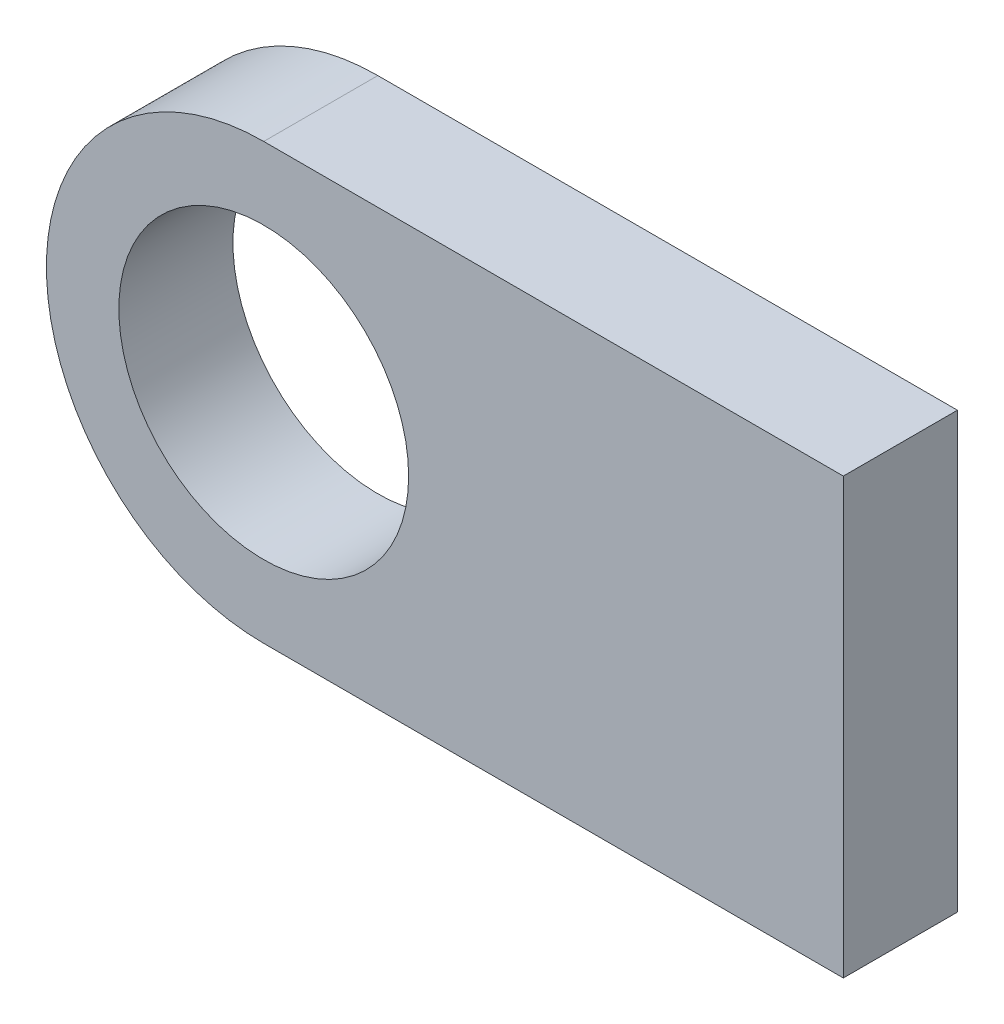
ISO-10303-21;
HEADER;
FILE_DESCRIPTION(('STEP AP214'),'2;1');
FILE_NAME('part.step','',(''),(''),'','','');
FILE_SCHEMA(('AUTOMOTIVE_DESIGN { 1 0 10303 214 1 1 1 1 }'));
ENDSEC;
DATA;
#1=APPLICATION_CONTEXT('core data for automotive mechanical design processes');
#2=APPLICATION_PROTOCOL_DEFINITION('international standard','automotive_design',2000,#1);
#3=PRODUCT_CONTEXT('',#1,'mechanical');
#4=PRODUCT('Part','Part','',(#3));
#5=PRODUCT_RELATED_PRODUCT_CATEGORY('part','',(#4));
#6=PRODUCT_DEFINITION_FORMATION('','',#4);
#7=PRODUCT_DEFINITION_CONTEXT('part definition',#1,'design');
#8=PRODUCT_DEFINITION('design','',#6,#7);
#9=PRODUCT_DEFINITION_SHAPE('','',#8);
#10=(LENGTH_UNIT() NAMED_UNIT(*) SI_UNIT(.MILLI.,.METRE.));
#11=(NAMED_UNIT(*) PLANE_ANGLE_UNIT() SI_UNIT($,.RADIAN.));
#12=(NAMED_UNIT(*) SI_UNIT($,.STERADIAN.) SOLID_ANGLE_UNIT());
#13=UNCERTAINTY_MEASURE_WITH_UNIT(LENGTH_MEASURE(1.E-05),#10,'distance_accuracy_value','');
#14=(GEOMETRIC_REPRESENTATION_CONTEXT(3) GLOBAL_UNCERTAINTY_ASSIGNED_CONTEXT((#13)) GLOBAL_UNIT_ASSIGNED_CONTEXT((#10,
#11,#12)) REPRESENTATION_CONTEXT('',''));
#15=CARTESIAN_POINT('',(0.,0.,0.));
#16=DIRECTION('',(0.,0.,1.));
#17=DIRECTION('',(1.,0.,0.));
#18=AXIS2_PLACEMENT_3D('',#15,#16,#17);
#19=CARTESIAN_POINT('',(0.,19.05,-10.000000066));
#20=DIRECTION('',(0.,0.,1.));
#21=DIRECTION('',(1.,0.,0.));
#22=AXIS2_PLACEMENT_3D('',#19,#20,#21);
#23=CYLINDRICAL_SURFACE('',#22,19.05);
#24=CARTESIAN_POINT('',(0.,19.05,0.));
#25=DIRECTION('',(0.,0.,1.));
#26=DIRECTION('',(1.,0.,0.));
#27=AXIS2_PLACEMENT_3D('',#24,#25,#26);
#28=CIRCLE('',#27,19.05);
#29=CARTESIAN_POINT('',(0.,38.1,0.));
#30=VERTEX_POINT('',#29);
#31=CARTESIAN_POINT('',(0.,0.,0.));
#32=VERTEX_POINT('',#31);
#33=EDGE_CURVE('E105',#30,#32,#28,.T.);
#34=ORIENTED_EDGE('',*,*,#33,.F.);
#35=DIRECTION('',(0.,0.,1.));
#36=VECTOR('',#35,1.);
#37=CARTESIAN_POINT('',(0.,38.1,-10.000000066));
#38=LINE('',#37,#36);
#39=CARTESIAN_POINT('',(0.,38.1,-10.000000066));
#40=VERTEX_POINT('',#39);
#41=EDGE_CURVE('E11',#40,#30,#38,.T.);
#42=ORIENTED_EDGE('',*,*,#41,.F.);
#43=CARTESIAN_POINT('',(0.,19.05,-10.000000066));
#44=DIRECTION('',(0.,0.,1.));
#45=DIRECTION('',(1.,0.,0.));
#46=AXIS2_PLACEMENT_3D('',#43,#44,#45);
#47=CIRCLE('',#46,19.05);
#48=CARTESIAN_POINT('',(0.,0.,-10.000000066));
#49=VERTEX_POINT('',#48);
#50=EDGE_CURVE('E98',#40,#49,#47,.T.);
#51=ORIENTED_EDGE('',*,*,#50,.T.);
#52=DIRECTION('',(0.,0.,1.));
#53=VECTOR('',#52,1.);
#54=CARTESIAN_POINT('',(0.,0.,-10.000000066));
#55=LINE('',#54,#53);
#56=EDGE_CURVE('E42',#49,#32,#55,.T.);
#57=ORIENTED_EDGE('',*,*,#56,.T.);
#58=EDGE_LOOP('',(#34,#42,#51,#57));
#59=FACE_BOUND('',#58,.T.);
#60=ADVANCED_FACE('F39',(#59),#23,.T.);
#61=CARTESIAN_POINT('',(0.,38.1,-10.000000066));
#62=DIRECTION('',(0.,1.,0.));
#63=DIRECTION('',(0.,0.,1.));
#64=AXIS2_PLACEMENT_3D('',#61,#62,#63);
#65=PLANE('',#64);
#66=DIRECTION('',(-1.,0.,0.));
#67=VECTOR('',#66,1.);
#68=CARTESIAN_POINT('',(0.,38.1,0.));
#69=LINE('',#68,#67);
#70=CARTESIAN_POINT('',(50.8,38.1,0.));
#71=VERTEX_POINT('',#70);
#72=EDGE_CURVE('E100',#71,#30,#69,.T.);
#73=ORIENTED_EDGE('',*,*,#72,.F.);
#74=DIRECTION('',(0.,0.,1.));
#75=VECTOR('',#74,1.);
#76=CARTESIAN_POINT('',(50.8,38.1,-10.000000066));
#77=LINE('',#76,#75);
#78=CARTESIAN_POINT('',(50.8,38.1,-10.000000066));
#79=VERTEX_POINT('',#78);
#80=EDGE_CURVE('E48',#79,#71,#77,.T.);
#81=ORIENTED_EDGE('',*,*,#80,.F.);
#82=DIRECTION('',(-1.,0.,0.));
#83=VECTOR('',#82,1.);
#84=CARTESIAN_POINT('',(0.,38.1,-10.000000066));
#85=LINE('',#84,#83);
#86=EDGE_CURVE('E95',#79,#40,#85,.T.);
#87=ORIENTED_EDGE('',*,*,#86,.T.);
#88=ORIENTED_EDGE('',*,*,#41,.T.);
#89=EDGE_LOOP('',(#73,#81,#87,#88));
#90=FACE_BOUND('',#89,.T.);
#91=ADVANCED_FACE('F116',(#90),#65,.T.);
#92=CARTESIAN_POINT('',(50.8,0.,-10.000000066));
#93=DIRECTION('',(1.,0.,0.));
#94=DIRECTION('',(0.,0.,-1.));
#95=AXIS2_PLACEMENT_3D('',#92,#93,#94);
#96=PLANE('',#95);
#97=DIRECTION('',(0.,1.,0.));
#98=VECTOR('',#97,1.);
#99=CARTESIAN_POINT('',(50.8,0.,0.));
#100=LINE('',#99,#98);
#101=CARTESIAN_POINT('',(50.8,0.,0.));
#102=VERTEX_POINT('',#101);
#103=EDGE_CURVE('E89',#102,#71,#100,.T.);
#104=ORIENTED_EDGE('',*,*,#103,.F.);
#105=DIRECTION('',(0.,0.,1.));
#106=VECTOR('',#105,1.);
#107=CARTESIAN_POINT('',(50.8,0.,-10.000000066));
#108=LINE('',#107,#106);
#109=CARTESIAN_POINT('',(50.8,0.,-10.000000066));
#110=VERTEX_POINT('',#109);
#111=EDGE_CURVE('E84',#110,#102,#108,.T.);
#112=ORIENTED_EDGE('',*,*,#111,.F.);
#113=DIRECTION('',(0.,1.,0.));
#114=VECTOR('',#113,1.);
#115=CARTESIAN_POINT('',(50.8,0.,-10.000000066));
#116=LINE('',#115,#114);
#117=EDGE_CURVE('E87',#110,#79,#116,.T.);
#118=ORIENTED_EDGE('',*,*,#117,.T.);
#119=ORIENTED_EDGE('',*,*,#80,.T.);
#120=EDGE_LOOP('',(#104,#112,#118,#119));
#121=FACE_BOUND('',#120,.T.);
#122=ADVANCED_FACE('F86',(#121),#96,.T.);
#123=CARTESIAN_POINT('',(0.,0.,-10.000000066));
#124=DIRECTION('',(0.,-1.,0.));
#125=DIRECTION('',(0.,0.,-1.));
#126=AXIS2_PLACEMENT_3D('',#123,#124,#125);
#127=PLANE('',#126);
#128=DIRECTION('',(1.,0.,0.));
#129=VECTOR('',#128,1.);
#130=CARTESIAN_POINT('',(0.,0.,0.));
#131=LINE('',#130,#129);
#132=EDGE_CURVE('E108',#32,#102,#131,.T.);
#133=ORIENTED_EDGE('',*,*,#132,.F.);
#134=ORIENTED_EDGE('',*,*,#56,.F.);
#135=DIRECTION('',(1.,0.,0.));
#136=VECTOR('',#135,1.);
#137=CARTESIAN_POINT('',(0.,0.,-10.000000066));
#138=LINE('',#137,#136);
#139=EDGE_CURVE('E94',#49,#110,#138,.T.);
#140=ORIENTED_EDGE('',*,*,#139,.T.);
#141=ORIENTED_EDGE('',*,*,#111,.T.);
#142=EDGE_LOOP('',(#133,#134,#140,#141));
#143=FACE_BOUND('',#142,.T.);
#144=ADVANCED_FACE('F97',(#143),#127,.T.);
#145=CARTESIAN_POINT('',(0.,19.05,-10.000000066));
#146=DIRECTION('',(0.,0.,1.));
#147=DIRECTION('',(1.,0.,0.));
#148=AXIS2_PLACEMENT_3D('',#145,#146,#147);
#149=PLANE('',#148);
#150=CARTESIAN_POINT('',(0.,19.05,-10.000000066));
#151=DIRECTION('',(0.,0.,1.));
#152=DIRECTION('',(1.,0.,0.));
#153=AXIS2_PLACEMENT_3D('',#150,#151,#152);
#154=CIRCLE('',#153,12.7);
#155=CARTESIAN_POINT('',(12.7,19.05,-10.000000066));
#156=VERTEX_POINT('',#155);
#157=EDGE_CURVE('E109',#156,#156,#154,.T.);
#158=ORIENTED_EDGE('',*,*,#157,.T.);
#159=EDGE_LOOP('',(#158));
#160=FACE_BOUND('',#159,.T.);
#161=ORIENTED_EDGE('',*,*,#50,.F.);
#162=ORIENTED_EDGE('',*,*,#86,.F.);
#163=ORIENTED_EDGE('',*,*,#117,.F.);
#164=ORIENTED_EDGE('',*,*,#139,.F.);
#165=EDGE_LOOP('',(#161,#162,#163,#164));
#166=FACE_BOUND('',#165,.T.);
#167=ADVANCED_FACE('F93',(#160,#166),#149,.F.);
#168=CARTESIAN_POINT('',(0.,19.05,0.));
#169=DIRECTION('',(0.,0.,1.));
#170=DIRECTION('',(1.,0.,0.));
#171=AXIS2_PLACEMENT_3D('',#168,#169,#170);
#172=PLANE('',#171);
#173=CARTESIAN_POINT('',(0.,19.05,0.));
#174=DIRECTION('',(0.,0.,1.));
#175=DIRECTION('',(1.,0.,0.));
#176=AXIS2_PLACEMENT_3D('',#173,#174,#175);
#177=CIRCLE('',#176,12.7);
#178=CARTESIAN_POINT('',(12.7,19.05,0.));
#179=VERTEX_POINT('',#178);
#180=EDGE_CURVE('E146',#179,#179,#177,.T.);
#181=ORIENTED_EDGE('',*,*,#180,.F.);
#182=EDGE_LOOP('',(#181));
#183=FACE_BOUND('',#182,.T.);
#184=ORIENTED_EDGE('',*,*,#33,.T.);
#185=ORIENTED_EDGE('',*,*,#132,.T.);
#186=ORIENTED_EDGE('',*,*,#103,.T.);
#187=ORIENTED_EDGE('',*,*,#72,.T.);
#188=EDGE_LOOP('',(#184,#185,#186,#187));
#189=FACE_BOUND('',#188,.T.);
#190=ADVANCED_FACE('F115',(#183,#189),#172,.T.);
#191=CARTESIAN_POINT('',(0.,19.05,-10.000000066));
#192=DIRECTION('',(0.,0.,1.));
#193=DIRECTION('',(1.,0.,0.));
#194=AXIS2_PLACEMENT_3D('',#191,#192,#193);
#195=CYLINDRICAL_SURFACE('',#194,12.7);
#196=ORIENTED_EDGE('',*,*,#157,.F.);
#197=EDGE_LOOP('',(#196));
#198=FACE_BOUND('',#197,.T.);
#199=ORIENTED_EDGE('',*,*,#180,.T.);
#200=EDGE_LOOP('',(#199));
#201=FACE_BOUND('',#200,.T.);
#202=ADVANCED_FACE('F134',(#198,#201),#195,.F.);
#203=CLOSED_SHELL('',(#60,#91,#122,#144,#167,#190,#202));
#204=MANIFOLD_SOLID_BREP('B2',#203);
#205=ADVANCED_BREP_SHAPE_REPRESENTATION('',(#18,#204),#14);
#206=SHAPE_DEFINITION_REPRESENTATION(#9,#205);
ENDSEC;
END-ISO-10303-21;
